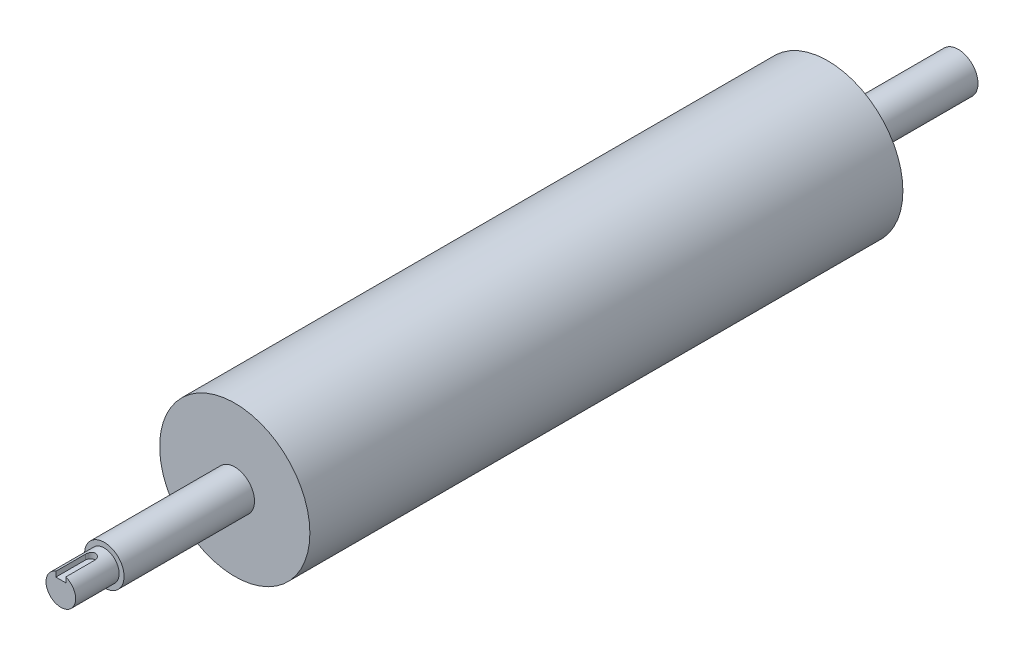
ISO-10303-21;
HEADER;
FILE_DESCRIPTION(('STEP AP214'),'2;1');
FILE_NAME('part.step','',(''),(''),'','','');
FILE_SCHEMA(('AUTOMOTIVE_DESIGN { 1 0 10303 214 1 1 1 1 }'));
ENDSEC;
DATA;
#1=APPLICATION_CONTEXT('core data for automotive mechanical design processes');
#2=APPLICATION_PROTOCOL_DEFINITION('international standard','automotive_design',2000,#1);
#3=PRODUCT_CONTEXT('',#1,'mechanical');
#4=PRODUCT('Part','Part','',(#3));
#5=PRODUCT_RELATED_PRODUCT_CATEGORY('part','',(#4));
#6=PRODUCT_DEFINITION_FORMATION('','',#4);
#7=PRODUCT_DEFINITION_CONTEXT('part definition',#1,'design');
#8=PRODUCT_DEFINITION('design','',#6,#7);
#9=PRODUCT_DEFINITION_SHAPE('','',#8);
#10=(LENGTH_UNIT() NAMED_UNIT(*) SI_UNIT(.MILLI.,.METRE.));
#11=(NAMED_UNIT(*) PLANE_ANGLE_UNIT() SI_UNIT($,.RADIAN.));
#12=(NAMED_UNIT(*) SI_UNIT($,.STERADIAN.) SOLID_ANGLE_UNIT());
#13=UNCERTAINTY_MEASURE_WITH_UNIT(LENGTH_MEASURE(1.E-05),#10,'distance_accuracy_value','');
#14=(GEOMETRIC_REPRESENTATION_CONTEXT(3) GLOBAL_UNCERTAINTY_ASSIGNED_CONTEXT((#13)) GLOBAL_UNIT_ASSIGNED_CONTEXT((#10,
#11,#12)) REPRESENTATION_CONTEXT('',''));
#15=CARTESIAN_POINT('',(0.,0.,0.));
#16=DIRECTION('',(0.,0.,1.));
#17=DIRECTION('',(1.,0.,0.));
#18=AXIS2_PLACEMENT_3D('',#15,#16,#17);
#19=CARTESIAN_POINT('',(0.,0.,150.));
#20=DIRECTION('',(0.,0.,-1.));
#21=DIRECTION('',(-1.,0.,0.));
#22=AXIS2_PLACEMENT_3D('',#19,#20,#21);
#23=CYLINDRICAL_SURFACE('',#22,38.);
#24=CARTESIAN_POINT('',(0.,0.,150.));
#25=DIRECTION('',(0.,0.,1.));
#26=DIRECTION('',(1.,0.,0.));
#27=AXIS2_PLACEMENT_3D('',#24,#25,#26);
#28=CIRCLE('',#27,38.);
#29=CARTESIAN_POINT('',(38.,0.,150.));
#30=VERTEX_POINT('',#29);
#31=EDGE_CURVE('E131',#30,#30,#28,.T.);
#32=ORIENTED_EDGE('',*,*,#31,.F.);
#33=EDGE_LOOP('',(#32));
#34=FACE_BOUND('',#33,.T.);
#35=CARTESIAN_POINT('',(0.,0.,-150.));
#36=DIRECTION('',(0.,0.,1.));
#37=DIRECTION('',(1.,0.,0.));
#38=AXIS2_PLACEMENT_3D('',#35,#36,#37);
#39=CIRCLE('',#38,38.);
#40=CARTESIAN_POINT('',(38.,0.,-150.));
#41=VERTEX_POINT('',#40);
#42=EDGE_CURVE('E128',#41,#41,#39,.T.);
#43=ORIENTED_EDGE('',*,*,#42,.T.);
#44=EDGE_LOOP('',(#43));
#45=FACE_BOUND('',#44,.T.);
#46=ADVANCED_FACE('F39',(#34,#45),#23,.T.);
#47=CARTESIAN_POINT('',(0.,0.,150.));
#48=DIRECTION('',(0.,0.,1.));
#49=DIRECTION('',(1.,0.,0.));
#50=AXIS2_PLACEMENT_3D('',#47,#48,#49);
#51=PLANE('',#50);
#52=CARTESIAN_POINT('',(0.,0.,150.));
#53=DIRECTION('',(0.,0.,1.));
#54=DIRECTION('',(1.,0.,0.));
#55=AXIS2_PLACEMENT_3D('',#52,#53,#54);
#56=CIRCLE('',#55,10.);
#57=CARTESIAN_POINT('',(10.,0.,150.));
#58=VERTEX_POINT('',#57);
#59=EDGE_CURVE('E119',#58,#58,#56,.T.);
#60=ORIENTED_EDGE('',*,*,#59,.F.);
#61=EDGE_LOOP('',(#60));
#62=FACE_BOUND('',#61,.T.);
#63=ORIENTED_EDGE('',*,*,#31,.T.);
#64=EDGE_LOOP('',(#63));
#65=FACE_BOUND('',#64,.T.);
#66=ADVANCED_FACE('F141',(#62,#65),#51,.T.);
#67=CARTESIAN_POINT('',(0.,0.,-150.));
#68=DIRECTION('',(0.,0.,1.));
#69=DIRECTION('',(1.,0.,0.));
#70=AXIS2_PLACEMENT_3D('',#67,#68,#69);
#71=PLANE('',#70);
#72=CARTESIAN_POINT('',(0.,0.,-150.));
#73=DIRECTION('',(0.,0.,1.));
#74=DIRECTION('',(1.,0.,0.));
#75=AXIS2_PLACEMENT_3D('',#72,#73,#74);
#76=CIRCLE('',#75,10.);
#77=CARTESIAN_POINT('',(10.,0.,-150.));
#78=VERTEX_POINT('',#77);
#79=EDGE_CURVE('E116',#78,#78,#76,.T.);
#80=ORIENTED_EDGE('',*,*,#79,.T.);
#81=EDGE_LOOP('',(#80));
#82=FACE_BOUND('',#81,.T.);
#83=ORIENTED_EDGE('',*,*,#42,.F.);
#84=EDGE_LOOP('',(#83));
#85=FACE_BOUND('',#84,.T.);
#86=ADVANCED_FACE('F138',(#82,#85),#71,.F.);
#87=CARTESIAN_POINT('',(0.,0.,216.));
#88=DIRECTION('',(0.,0.,-1.));
#89=DIRECTION('',(-1.,0.,0.));
#90=AXIS2_PLACEMENT_3D('',#87,#88,#89);
#91=CYLINDRICAL_SURFACE('',#90,10.);
#92=CARTESIAN_POINT('',(0.,0.,216.));
#93=DIRECTION('',(0.,0.,1.));
#94=DIRECTION('',(1.,0.,0.));
#95=AXIS2_PLACEMENT_3D('',#92,#93,#94);
#96=CIRCLE('',#95,10.);
#97=CARTESIAN_POINT('',(10.,0.,216.));
#98=VERTEX_POINT('',#97);
#99=EDGE_CURVE('E123',#98,#98,#96,.T.);
#100=ORIENTED_EDGE('',*,*,#99,.F.);
#101=EDGE_LOOP('',(#100));
#102=FACE_BOUND('',#101,.T.);
#103=ORIENTED_EDGE('',*,*,#59,.T.);
#104=EDGE_LOOP('',(#103));
#105=FACE_BOUND('',#104,.T.);
#106=ADVANCED_FACE('F140',(#102,#105),#91,.T.);
#107=CARTESIAN_POINT('',(0.,0.,216.));
#108=DIRECTION('',(0.,0.,1.));
#109=DIRECTION('',(1.,0.,0.));
#110=AXIS2_PLACEMENT_3D('',#107,#108,#109);
#111=PLANE('',#110);
#112=CARTESIAN_POINT('',(0.,0.,216.));
#113=DIRECTION('',(0.,0.,1.));
#114=DIRECTION('',(1.,0.,0.));
#115=AXIS2_PLACEMENT_3D('',#112,#113,#114);
#116=CIRCLE('',#115,7.5);
#117=CARTESIAN_POINT('',(7.5,0.,216.));
#118=VERTEX_POINT('',#117);
#119=EDGE_CURVE('E91',#118,#118,#116,.T.);
#120=ORIENTED_EDGE('',*,*,#119,.F.);
#121=EDGE_LOOP('',(#120));
#122=FACE_BOUND('',#121,.T.);
#123=ORIENTED_EDGE('',*,*,#99,.T.);
#124=EDGE_LOOP('',(#123));
#125=FACE_BOUND('',#124,.T.);
#126=ADVANCED_FACE('F147',(#122,#125),#111,.T.);
#127=CARTESIAN_POINT('',(0.,0.,-216.));
#128=DIRECTION('',(0.,0.,1.));
#129=DIRECTION('',(1.,0.,0.));
#130=AXIS2_PLACEMENT_3D('',#127,#128,#129);
#131=CYLINDRICAL_SURFACE('',#130,10.);
#132=CARTESIAN_POINT('',(0.,0.,-216.));
#133=DIRECTION('',(0.,0.,1.));
#134=DIRECTION('',(1.,0.,0.));
#135=AXIS2_PLACEMENT_3D('',#132,#133,#134);
#136=CIRCLE('',#135,10.);
#137=CARTESIAN_POINT('',(10.,0.,-216.));
#138=VERTEX_POINT('',#137);
#139=EDGE_CURVE('E120',#138,#138,#136,.T.);
#140=ORIENTED_EDGE('',*,*,#139,.T.);
#141=EDGE_LOOP('',(#140));
#142=FACE_BOUND('',#141,.T.);
#143=ORIENTED_EDGE('',*,*,#79,.F.);
#144=EDGE_LOOP('',(#143));
#145=FACE_BOUND('',#144,.T.);
#146=ADVANCED_FACE('F182',(#142,#145),#131,.T.);
#147=CARTESIAN_POINT('',(0.,0.,-216.));
#148=DIRECTION('',(0.,0.,-1.));
#149=DIRECTION('',(1.,0.,0.));
#150=AXIS2_PLACEMENT_3D('',#147,#148,#149);
#151=PLANE('',#150);
#152=ORIENTED_EDGE('',*,*,#139,.F.);
#153=EDGE_LOOP('',(#152));
#154=FACE_BOUND('',#153,.T.);
#155=ADVANCED_FACE('F193',(#154),#151,.T.);
#156=CARTESIAN_POINT('',(0.,0.,238.));
#157=DIRECTION('',(0.,0.,-1.));
#158=DIRECTION('',(-1.,0.,0.));
#159=AXIS2_PLACEMENT_3D('',#156,#157,#158);
#160=CYLINDRICAL_SURFACE('',#159,7.5);
#161=CARTESIAN_POINT('',(0.,0.,238.));
#162=DIRECTION('',(0.,0.,1.));
#163=DIRECTION('',(1.,0.,0.));
#164=AXIS2_PLACEMENT_3D('',#161,#162,#163);
#165=CIRCLE('',#164,7.5);
#166=CARTESIAN_POINT('',(-2.5,7.07106781186548,238.));
#167=VERTEX_POINT('',#166);
#168=CARTESIAN_POINT('',(2.5,7.07106781186548,238.));
#169=VERTEX_POINT('',#168);
#170=EDGE_CURVE('E104',#167,#169,#165,.T.);
#171=ORIENTED_EDGE('',*,*,#170,.F.);
#172=DIRECTION('',(0.,0.,-1.));
#173=VECTOR('',#172,1.);
#174=CARTESIAN_POINT('',(-2.5,7.07106781186548,238.));
#175=LINE('',#174,#173);
#176=CARTESIAN_POINT('',(-2.5,7.07106781186548,223.));
#177=VERTEX_POINT('',#176);
#178=EDGE_CURVE('E66',#167,#177,#175,.T.);
#179=ORIENTED_EDGE('',*,*,#178,.T.);
#180=CARTESIAN_POINT('',(-2.5,7.07106781186548,223.));
#181=CARTESIAN_POINT('',(-2.50000899110406,7.07105693273157,222.93179292218));
#182=CARTESIAN_POINT('',(-2.49720887221585,7.07205443904569,222.863591925325));
#183=CARTESIAN_POINT('',(-2.4860604578047,7.07598524121007,222.727718961651));
#184=CARTESIAN_POINT('',(-2.47771365997202,7.07891801450643,222.660046857012));
#185=CARTESIAN_POINT('',(-2.45557459422795,7.08662705252507,222.525909511645));
#186=CARTESIAN_POINT('',(-2.44179847763135,7.09139784850119,222.459441297449));
#187=CARTESIAN_POINT('',(-2.4089418103012,7.10262619906002,222.327991731417));
#188=CARTESIAN_POINT('',(-2.38986106786031,7.10908381460331,222.26301043341));
#189=CARTESIAN_POINT('',(-2.32491551306194,7.13069940793912,222.071038420285));
#190=CARTESIAN_POINT('',(-2.27131416810248,7.14811243884052,221.94682084253));
#191=CARTESIAN_POINT('',(-2.14517784106252,7.18697034087521,221.709123188537));
#192=CARTESIAN_POINT('',(-2.07263123268529,7.20841768551077,221.59564976422));
#193=CARTESIAN_POINT('',(-1.90762995846817,7.25386182389479,221.378207096529));
#194=CARTESIAN_POINT('',(-1.81456284630833,7.27792189428067,221.274714857232));
#195=CARTESIAN_POINT('',(-1.61247071190512,7.32534626726038,221.084482896766));
#196=CARTESIAN_POINT('',(-1.50344285413657,7.34871044533518,220.997746158681));
#197=CARTESIAN_POINT('',(-1.26900922493971,7.39284706096344,220.841301775738));
#198=CARTESIAN_POINT('',(-1.1432502528446,7.41353593532888,220.772097692258));
#199=CARTESIAN_POINT('',(-0.881073095475287,7.44924021883279,220.656019217565));
#200=CARTESIAN_POINT('',(-0.744658181225881,7.46425736081204,220.609138005074));
#201=CARTESIAN_POINT('',(-0.470073371182905,7.48647677762783,220.540660723742));
#202=CARTESIAN_POINT('',(-0.332129588153739,7.49393272446142,220.518241829043));
#203=CARTESIAN_POINT('',(-0.0542474216361916,7.50109021034827,220.496709243261));
#204=CARTESIAN_POINT('',(0.0856904786402271,7.50079359709905,220.497589999084));
#205=CARTESIAN_POINT('',(0.357759612692417,7.49265096581776,220.5221107104));
#206=CARTESIAN_POINT('',(0.489981756428185,7.48510152476446,220.544856595605));
#207=CARTESIAN_POINT('',(0.748610161077324,7.46367401253771,220.610982995979));
#208=CARTESIAN_POINT('',(0.875016099077749,7.44979559044789,220.654364655325));
#209=CARTESIAN_POINT('',(1.12038155754036,7.41689170677793,220.761053424194));
#210=CARTESIAN_POINT('',(1.23922126412504,7.39780094595656,220.824615112858));
#211=CARTESIAN_POINT('',(1.46481147275368,7.35645969200235,220.969649878425));
#212=CARTESIAN_POINT('',(1.57155867428944,7.33420833994017,221.051127827602));
#213=CARTESIAN_POINT('',(1.77524334927518,7.28765679856813,221.234177625007));
#214=CARTESIAN_POINT('',(1.87148402903098,7.26330946699776,221.336513859028));
#215=CARTESIAN_POINT('',(2.04568006205172,7.21618726182137,221.556103724286));
#216=CARTESIAN_POINT('',(2.12362950795975,7.19341289789385,221.673362156007));
#217=CARTESIAN_POINT('',(2.26000831398176,7.15175078440791,221.921700445884));
#218=CARTESIAN_POINT('',(2.31813252376915,7.13292537370586,222.052958787333));
#219=CARTESIAN_POINT('',(2.41115057675284,7.10202742655098,222.324117443975));
#220=CARTESIAN_POINT('',(2.4460810901384,7.08994423522482,222.46400373343));
#221=CARTESIAN_POINT('',(2.47914539070207,7.078413552368,222.67104659187));
#222=CARTESIAN_POINT('',(2.48696265313779,7.07566669236505,222.736603474636));
#223=CARTESIAN_POINT('',(2.497386540178,7.07199258928497,222.868095195999));
#224=CARTESIAN_POINT('',(2.49999988848745,7.0710629982382,222.934029436361));
#225=CARTESIAN_POINT('',(2.5,7.07106781186548,223.));
#226=B_SPLINE_CURVE_WITH_KNOTS('',3,(#180,#181,#182,#183,#184,#185,#186,#187,#188,#189,#190,
#191,#192,#193,#194,#195,#196,#197,#198,#199,#200,#201,#202,#203,#204,#205,#206,#207,#208,#209,
#210,#211,#212,#213,#214,#215,#216,#217,#218,#219,#220,#221,#222,#223,#224,#225),.UNSPECIFIED.,
.F.,.F.,(4,2,2,2,2,2,2,2,2,2,2,2,2,2,2,2,2,2,2,2,2,2,4),(0.,0.204546211838573,0.409037215423663,
0.612924429429113,0.816819012805403,1.2240101692326,1.63145179965524,2.05327864088391,
2.47518051341065,2.90809434014449,3.34087579484513,3.75860278500203,4.17623021758302,
4.57747647846034,4.97874498952316,5.38529148746615,5.79194868153618,6.2177173682682,
6.64362337304803,7.07581676501795,7.50732520398795,7.7053634001357,7.90314555504337),.UNSPECIFIED.);
#227=CARTESIAN_POINT('',(2.5,7.07106781186548,223.));
#228=VERTEX_POINT('',#227);
#229=EDGE_CURVE('E11',#177,#228,#226,.T.);
#230=ORIENTED_EDGE('',*,*,#229,.T.);
#231=DIRECTION('',(0.,0.,-1.));
#232=VECTOR('',#231,1.);
#233=CARTESIAN_POINT('',(2.5,7.07106781186548,238.));
#234=LINE('',#233,#232);
#235=EDGE_CURVE('E111',#228,#169,#234,.F.);
#236=ORIENTED_EDGE('',*,*,#235,.T.);
#237=EDGE_LOOP('',(#171,#179,#230,#236));
#238=FACE_BOUND('',#237,.T.);
#239=ORIENTED_EDGE('',*,*,#119,.T.);
#240=EDGE_LOOP('',(#239));
#241=FACE_BOUND('',#240,.T.);
#242=ADVANCED_FACE('F202',(#238,#241),#160,.T.);
#243=CARTESIAN_POINT('',(0.,0.,238.));
#244=DIRECTION('',(0.,0.,1.));
#245=DIRECTION('',(1.,0.,0.));
#246=AXIS2_PLACEMENT_3D('',#243,#244,#245);
#247=PLANE('',#246);
#248=DIRECTION('',(0.,1.,0.));
#249=VECTOR('',#248,1.);
#250=CARTESIAN_POINT('',(-2.5,4.5,238.));
#251=LINE('',#250,#249);
#252=CARTESIAN_POINT('',(-2.5,4.5,238.));
#253=VERTEX_POINT('',#252);
#254=EDGE_CURVE('E113',#253,#167,#251,.T.);
#255=ORIENTED_EDGE('',*,*,#254,.T.);
#256=ORIENTED_EDGE('',*,*,#170,.T.);
#257=DIRECTION('',(0.,1.,0.));
#258=VECTOR('',#257,1.);
#259=CARTESIAN_POINT('',(2.5,4.5,238.));
#260=LINE('',#259,#258);
#261=CARTESIAN_POINT('',(2.5,4.5,238.));
#262=VERTEX_POINT('',#261);
#263=EDGE_CURVE('E94',#262,#169,#260,.T.);
#264=ORIENTED_EDGE('',*,*,#263,.F.);
#265=DIRECTION('',(-1.,0.,0.));
#266=VECTOR('',#265,1.);
#267=CARTESIAN_POINT('',(0.,4.5,238.));
#268=LINE('',#267,#266);
#269=EDGE_CURVE('E52',#262,#253,#268,.T.);
#270=ORIENTED_EDGE('',*,*,#269,.T.);
#271=EDGE_LOOP('',(#255,#256,#264,#270));
#272=FACE_BOUND('',#271,.T.);
#273=ADVANCED_FACE('F102',(#272),#247,.T.);
#274=CARTESIAN_POINT('',(0.,4.5,223.));
#275=DIRECTION('',(0.,1.,0.));
#276=DIRECTION('',(0.,0.,1.));
#277=AXIS2_PLACEMENT_3D('',#274,#275,#276);
#278=CYLINDRICAL_SURFACE('',#277,2.5);
#279=DIRECTION('',(0.,1.,0.));
#280=VECTOR('',#279,1.);
#281=CARTESIAN_POINT('',(-2.5,4.5,223.));
#282=LINE('',#281,#280);
#283=CARTESIAN_POINT('',(-2.5,4.5,223.));
#284=VERTEX_POINT('',#283);
#285=EDGE_CURVE('E106',#284,#177,#282,.T.);
#286=ORIENTED_EDGE('',*,*,#285,.F.);
#287=CARTESIAN_POINT('',(0.,4.5,223.));
#288=DIRECTION('',(0.,1.,0.));
#289=DIRECTION('',(0.,0.,1.));
#290=AXIS2_PLACEMENT_3D('',#287,#288,#289);
#291=CIRCLE('',#290,2.5);
#292=CARTESIAN_POINT('',(2.5,4.5,223.));
#293=VERTEX_POINT('',#292);
#294=EDGE_CURVE('E99',#293,#284,#291,.T.);
#295=ORIENTED_EDGE('',*,*,#294,.F.);
#296=DIRECTION('',(0.,1.,0.));
#297=VECTOR('',#296,1.);
#298=CARTESIAN_POINT('',(2.5,4.5,223.));
#299=LINE('',#298,#297);
#300=EDGE_CURVE('E97',#293,#228,#299,.T.);
#301=ORIENTED_EDGE('',*,*,#300,.T.);
#302=ORIENTED_EDGE('',*,*,#229,.F.);
#303=EDGE_LOOP('',(#286,#295,#301,#302));
#304=FACE_BOUND('',#303,.T.);
#305=ADVANCED_FACE('F219',(#304),#278,.F.);
#306=CARTESIAN_POINT('',(-2.5,4.5,238.));
#307=DIRECTION('',(-1.,0.,0.));
#308=DIRECTION('',(0.,0.,1.));
#309=AXIS2_PLACEMENT_3D('',#306,#307,#308);
#310=PLANE('',#309);
#311=ORIENTED_EDGE('',*,*,#254,.F.);
#312=DIRECTION('',(0.,0.,1.));
#313=VECTOR('',#312,1.);
#314=CARTESIAN_POINT('',(-2.5,4.5,238.));
#315=LINE('',#314,#313);
#316=EDGE_CURVE('E59',#284,#253,#315,.T.);
#317=ORIENTED_EDGE('',*,*,#316,.F.);
#318=ORIENTED_EDGE('',*,*,#285,.T.);
#319=ORIENTED_EDGE('',*,*,#178,.F.);
#320=EDGE_LOOP('',(#311,#317,#318,#319));
#321=FACE_BOUND('',#320,.T.);
#322=ADVANCED_FACE('F228',(#321),#310,.F.);
#323=CARTESIAN_POINT('',(2.5,4.5,238.));
#324=DIRECTION('',(1.,0.,0.));
#325=DIRECTION('',(0.,0.,-1.));
#326=AXIS2_PLACEMENT_3D('',#323,#324,#325);
#327=PLANE('',#326);
#328=ORIENTED_EDGE('',*,*,#300,.F.);
#329=DIRECTION('',(0.,0.,-1.));
#330=VECTOR('',#329,1.);
#331=CARTESIAN_POINT('',(2.5,4.5,238.));
#332=LINE('',#331,#330);
#333=EDGE_CURVE('E88',#262,#293,#332,.T.);
#334=ORIENTED_EDGE('',*,*,#333,.F.);
#335=ORIENTED_EDGE('',*,*,#263,.T.);
#336=ORIENTED_EDGE('',*,*,#235,.F.);
#337=EDGE_LOOP('',(#328,#334,#335,#336));
#338=FACE_BOUND('',#337,.T.);
#339=ADVANCED_FACE('F93',(#338),#327,.F.);
#340=CARTESIAN_POINT('',(0.,4.5,238.));
#341=DIRECTION('',(0.,1.,0.));
#342=DIRECTION('',(0.,0.,1.));
#343=AXIS2_PLACEMENT_3D('',#340,#341,#342);
#344=PLANE('',#343);
#345=ORIENTED_EDGE('',*,*,#333,.T.);
#346=ORIENTED_EDGE('',*,*,#294,.T.);
#347=ORIENTED_EDGE('',*,*,#316,.T.);
#348=ORIENTED_EDGE('',*,*,#269,.F.);
#349=EDGE_LOOP('',(#345,#346,#347,#348));
#350=FACE_BOUND('',#349,.T.);
#351=ADVANCED_FACE('F87',(#350),#344,.T.);
#352=CLOSED_SHELL('',(#46,#66,#86,#106,#126,#146,#155,#242,#273,#305,#322,#339,#351));
#353=MANIFOLD_SOLID_BREP('B2',#352);
#354=ADVANCED_BREP_SHAPE_REPRESENTATION('',(#18,#353),#14);
#355=SHAPE_DEFINITION_REPRESENTATION(#9,#354);
ENDSEC;
END-ISO-10303-21;
